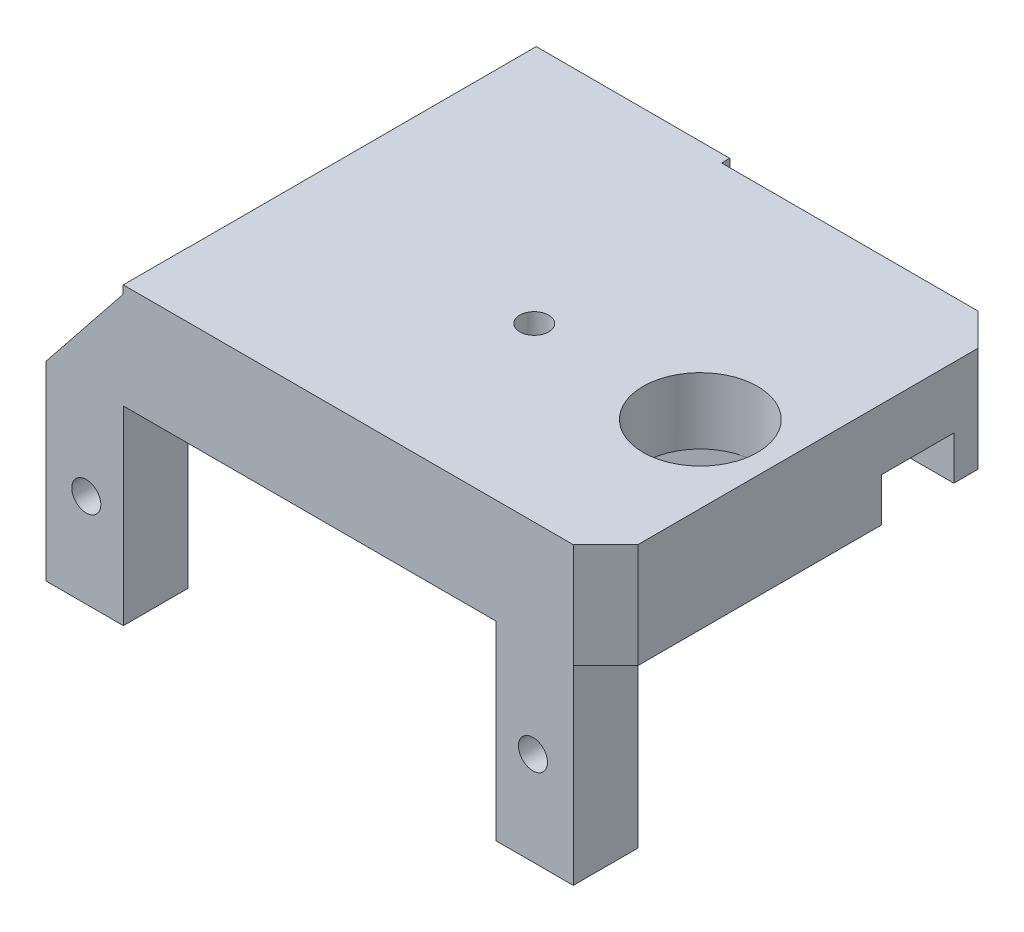
ISO-10303-21;
HEADER;
FILE_DESCRIPTION(('STEP AP214'),'2;1');
FILE_NAME('part.step','',(''),(''),'','','');
FILE_SCHEMA(('AUTOMOTIVE_DESIGN { 1 0 10303 214 1 1 1 1 }'));
ENDSEC;
DATA;
#1=APPLICATION_CONTEXT('core data for automotive mechanical design processes');
#2=APPLICATION_PROTOCOL_DEFINITION('international standard','automotive_design',2000,#1);
#3=PRODUCT_CONTEXT('',#1,'mechanical');
#4=PRODUCT('Part','Part','',(#3));
#5=PRODUCT_RELATED_PRODUCT_CATEGORY('part','',(#4));
#6=PRODUCT_DEFINITION_FORMATION('','',#4);
#7=PRODUCT_DEFINITION_CONTEXT('part definition',#1,'design');
#8=PRODUCT_DEFINITION('design','',#6,#7);
#9=PRODUCT_DEFINITION_SHAPE('','',#8);
#10=(LENGTH_UNIT() NAMED_UNIT(*) SI_UNIT(.MILLI.,.METRE.));
#11=(NAMED_UNIT(*) PLANE_ANGLE_UNIT() SI_UNIT($,.RADIAN.));
#12=(NAMED_UNIT(*) SI_UNIT($,.STERADIAN.) SOLID_ANGLE_UNIT());
#13=UNCERTAINTY_MEASURE_WITH_UNIT(LENGTH_MEASURE(1.E-05),#10,'distance_accuracy_value','');
#14=(GEOMETRIC_REPRESENTATION_CONTEXT(3) GLOBAL_UNCERTAINTY_ASSIGNED_CONTEXT((#13)) GLOBAL_UNIT_ASSIGNED_CONTEXT((#10,
#11,#12)) REPRESENTATION_CONTEXT('',''));
#15=CARTESIAN_POINT('',(0.,0.,0.));
#16=DIRECTION('',(0.,0.,1.));
#17=DIRECTION('',(1.,0.,0.));
#18=AXIS2_PLACEMENT_3D('',#15,#16,#17);
#19=CARTESIAN_POINT('',(-48.2602629267397,6.,0.));
#20=DIRECTION('',(0.78152047241882,-0.623879596709385,0.));
#21=DIRECTION('',(0.,0.,-1.));
#22=AXIS2_PLACEMENT_3D('',#19,#20,#21);
#23=PLANE('',#22);
#24=DIRECTION('',(0.,0.,-1.));
#25=VECTOR('',#24,1.);
#26=CARTESIAN_POINT('',(-48.2602629267397,6.,0.));
#27=LINE('',#26,#25);
#28=CARTESIAN_POINT('',(-48.2602629267397,6.,13.55));
#29=VERTEX_POINT('',#28);
#30=CARTESIAN_POINT('',(-48.2602629267397,6.,9.55));
#31=VERTEX_POINT('',#30);
#32=EDGE_CURVE('E425',#29,#31,#27,.T.);
#33=ORIENTED_EDGE('',*,*,#32,.T.);
#34=DIRECTION('',(0.623879596709387,0.781520472418818,0.));
#35=VECTOR('',#34,1.);
#36=CARTESIAN_POINT('',(-53.05,0.,9.55));
#37=LINE('',#36,#35);
#38=CARTESIAN_POINT('',(-53.05,0.,9.55));
#39=VERTEX_POINT('',#38);
#40=EDGE_CURVE('E266',#39,#31,#37,.T.);
#41=ORIENTED_EDGE('',*,*,#40,.F.);
#42=DIRECTION('',(0.,0.,1.));
#43=VECTOR('',#42,1.);
#44=CARTESIAN_POINT('',(-53.05,0.,11.55));
#45=LINE('',#44,#43);
#46=CARTESIAN_POINT('',(-53.05,0.,13.55));
#47=VERTEX_POINT('',#46);
#48=EDGE_CURVE('E428',#39,#47,#45,.T.);
#49=ORIENTED_EDGE('',*,*,#48,.T.);
#50=DIRECTION('',(-0.623879596709385,-0.78152047241882,0.));
#51=VECTOR('',#50,1.);
#52=CARTESIAN_POINT('',(-48.2602629267397,6.,13.55));
#53=LINE('',#52,#51);
#54=EDGE_CURVE('E303',#29,#47,#53,.T.);
#55=ORIENTED_EDGE('',*,*,#54,.F.);
#56=EDGE_LOOP('',(#33,#41,#49,#55));
#57=FACE_BOUND('',#56,.T.);
#58=ADVANCED_FACE('F32',(#57),#23,.F.);
#59=CARTESIAN_POINT('',(-20.35,-11.8,11.55));
#60=DIRECTION('',(1.,0.,0.));
#61=DIRECTION('',(0.,0.,1.));
#62=AXIS2_PLACEMENT_3D('',#59,#60,#61);
#63=PLANE('',#62);
#64=DIRECTION('',(0.,0.,1.));
#65=VECTOR('',#64,1.);
#66=CARTESIAN_POINT('',(-20.35,0.,0.));
#67=LINE('',#66,#65);
#68=CARTESIAN_POINT('',(-20.35,0.,9.55));
#69=VERTEX_POINT('',#68);
#70=CARTESIAN_POINT('',(-20.35,0.,13.55));
#71=VERTEX_POINT('',#70);
#72=EDGE_CURVE('E420',#69,#71,#67,.T.);
#73=ORIENTED_EDGE('',*,*,#72,.T.);
#74=DIRECTION('',(0.,1.,0.));
#75=VECTOR('',#74,1.);
#76=CARTESIAN_POINT('',(-20.35,0.,13.55));
#77=LINE('',#76,#75);
#78=CARTESIAN_POINT('',(-20.35,-11.8,13.55));
#79=VERTEX_POINT('',#78);
#80=EDGE_CURVE('E300',#79,#71,#77,.T.);
#81=ORIENTED_EDGE('',*,*,#80,.F.);
#82=DIRECTION('',(0.,0.,1.));
#83=VECTOR('',#82,1.);
#84=CARTESIAN_POINT('',(-20.35,-11.8,11.55));
#85=LINE('',#84,#83);
#86=CARTESIAN_POINT('',(-20.35,-11.8,9.55));
#87=VERTEX_POINT('',#86);
#88=EDGE_CURVE('E376',#87,#79,#85,.T.);
#89=ORIENTED_EDGE('',*,*,#88,.F.);
#90=DIRECTION('',(0.,-1.,0.));
#91=VECTOR('',#90,1.);
#92=CARTESIAN_POINT('',(-20.35,0.,9.55));
#93=LINE('',#92,#91);
#94=EDGE_CURVE('E48',#69,#87,#93,.T.);
#95=ORIENTED_EDGE('',*,*,#94,.F.);
#96=EDGE_LOOP('',(#73,#81,#89,#95));
#97=FACE_BOUND('',#96,.T.);
#98=ADVANCED_FACE('F526',(#97),#63,.T.);
#99=CARTESIAN_POINT('',(-25.15,-11.8,11.55));
#100=DIRECTION('',(-1.,0.,0.));
#101=DIRECTION('',(0.,0.,-1.));
#102=AXIS2_PLACEMENT_3D('',#99,#100,#101);
#103=PLANE('',#102);
#104=DIRECTION('',(0.,0.,-1.));
#105=VECTOR('',#104,1.);
#106=CARTESIAN_POINT('',(-25.15,0.,0.));
#107=LINE('',#106,#105);
#108=CARTESIAN_POINT('',(-25.15,0.,13.55));
#109=VERTEX_POINT('',#108);
#110=CARTESIAN_POINT('',(-25.15,0.,9.55));
#111=VERTEX_POINT('',#110);
#112=EDGE_CURVE('E422',#109,#111,#107,.T.);
#113=ORIENTED_EDGE('',*,*,#112,.T.);
#114=DIRECTION('',(0.,-1.,0.));
#115=VECTOR('',#114,1.);
#116=CARTESIAN_POINT('',(-25.15,-11.8,9.55));
#117=LINE('',#116,#115);
#118=CARTESIAN_POINT('',(-25.15,-11.8,9.55));
#119=VERTEX_POINT('',#118);
#120=EDGE_CURVE('E291',#111,#119,#117,.T.);
#121=ORIENTED_EDGE('',*,*,#120,.T.);
#122=DIRECTION('',(0.,0.,-1.));
#123=VECTOR('',#122,1.);
#124=CARTESIAN_POINT('',(-25.15,-11.8,11.55));
#125=LINE('',#124,#123);
#126=CARTESIAN_POINT('',(-25.15,-11.8,13.55));
#127=VERTEX_POINT('',#126);
#128=EDGE_CURVE('E373',#127,#119,#125,.T.);
#129=ORIENTED_EDGE('',*,*,#128,.F.);
#130=DIRECTION('',(0.,-1.,0.));
#131=VECTOR('',#130,1.);
#132=CARTESIAN_POINT('',(-25.15,0.,13.55));
#133=LINE('',#132,#131);
#134=EDGE_CURVE('E318',#109,#127,#133,.T.);
#135=ORIENTED_EDGE('',*,*,#134,.F.);
#136=EDGE_LOOP('',(#113,#121,#129,#135));
#137=FACE_BOUND('',#136,.T.);
#138=ADVANCED_FACE('F519',(#137),#103,.T.);
#139=CARTESIAN_POINT('',(-36.7,-11.8,0.));
#140=DIRECTION('',(0.,1.,0.));
#141=DIRECTION('',(0.,0.,1.));
#142=AXIS2_PLACEMENT_3D('',#139,#140,#141);
#143=PLANE('',#142);
#144=DIRECTION('',(-1.,0.,0.));
#145=VECTOR('',#144,1.);
#146=CARTESIAN_POINT('',(-20.35,-11.8,9.55));
#147=LINE('',#146,#145);
#148=EDGE_CURVE('E278',#87,#119,#147,.T.);
#149=ORIENTED_EDGE('',*,*,#148,.F.);
#150=ORIENTED_EDGE('',*,*,#88,.T.);
#151=DIRECTION('',(1.,0.,0.));
#152=VECTOR('',#151,1.);
#153=CARTESIAN_POINT('',(-25.15,-11.8,13.55));
#154=LINE('',#153,#152);
#155=EDGE_CURVE('E321',#127,#79,#154,.T.);
#156=ORIENTED_EDGE('',*,*,#155,.F.);
#157=ORIENTED_EDGE('',*,*,#128,.T.);
#158=EDGE_LOOP('',(#149,#150,#156,#157));
#159=FACE_BOUND('',#158,.T.);
#160=ADVANCED_FACE('F522',(#159),#143,.F.);
#161=CARTESIAN_POINT('',(-48.25,-11.8,11.55));
#162=DIRECTION('',(1.,0.,0.));
#163=DIRECTION('',(0.,0.,1.));
#164=AXIS2_PLACEMENT_3D('',#161,#162,#163);
#165=PLANE('',#164);
#166=DIRECTION('',(0.,0.,1.));
#167=VECTOR('',#166,1.);
#168=CARTESIAN_POINT('',(-48.25,-11.8,11.55));
#169=LINE('',#168,#167);
#170=CARTESIAN_POINT('',(-48.25,-11.8,9.55));
#171=VERTEX_POINT('',#170);
#172=CARTESIAN_POINT('',(-48.25,-11.8,13.55));
#173=VERTEX_POINT('',#172);
#174=EDGE_CURVE('E360',#171,#173,#169,.T.);
#175=ORIENTED_EDGE('',*,*,#174,.F.);
#176=DIRECTION('',(0.,1.,0.));
#177=VECTOR('',#176,1.);
#178=CARTESIAN_POINT('',(-48.25,-11.8,9.55));
#179=LINE('',#178,#177);
#180=CARTESIAN_POINT('',(-48.25,0.,9.55));
#181=VERTEX_POINT('',#180);
#182=EDGE_CURVE('E288',#171,#181,#179,.T.);
#183=ORIENTED_EDGE('',*,*,#182,.T.);
#184=DIRECTION('',(0.,0.,-1.));
#185=VECTOR('',#184,1.);
#186=CARTESIAN_POINT('',(-48.25,0.,11.55));
#187=LINE('',#186,#185);
#188=CARTESIAN_POINT('',(-48.25,0.,13.55));
#189=VERTEX_POINT('',#188);
#190=EDGE_CURVE('E410',#189,#181,#187,.T.);
#191=ORIENTED_EDGE('',*,*,#190,.F.);
#192=DIRECTION('',(0.,1.,0.));
#193=VECTOR('',#192,1.);
#194=CARTESIAN_POINT('',(-48.25,-11.8,13.55));
#195=LINE('',#194,#193);
#196=EDGE_CURVE('E312',#173,#189,#195,.T.);
#197=ORIENTED_EDGE('',*,*,#196,.F.);
#198=EDGE_LOOP('',(#175,#183,#191,#197));
#199=FACE_BOUND('',#198,.T.);
#200=ADVANCED_FACE('F509',(#199),#165,.T.);
#201=CARTESIAN_POINT('',(-53.05,-11.8,11.55));
#202=DIRECTION('',(-1.,0.,0.));
#203=DIRECTION('',(0.,0.,-1.));
#204=AXIS2_PLACEMENT_3D('',#201,#202,#203);
#205=PLANE('',#204);
#206=ORIENTED_EDGE('',*,*,#48,.F.);
#207=DIRECTION('',(0.,1.,0.));
#208=VECTOR('',#207,1.);
#209=CARTESIAN_POINT('',(-53.05,0.,9.55));
#210=LINE('',#209,#208);
#211=CARTESIAN_POINT('',(-53.05,-11.8,9.55));
#212=VERTEX_POINT('',#211);
#213=EDGE_CURVE('E280',#212,#39,#210,.T.);
#214=ORIENTED_EDGE('',*,*,#213,.F.);
#215=DIRECTION('',(0.,0.,-1.));
#216=VECTOR('',#215,1.);
#217=CARTESIAN_POINT('',(-53.05,-11.8,11.55));
#218=LINE('',#217,#216);
#219=CARTESIAN_POINT('',(-53.05,-11.8,13.55));
#220=VERTEX_POINT('',#219);
#221=EDGE_CURVE('E370',#220,#212,#218,.T.);
#222=ORIENTED_EDGE('',*,*,#221,.F.);
#223=DIRECTION('',(0.,-1.,0.));
#224=VECTOR('',#223,1.);
#225=CARTESIAN_POINT('',(-53.05,0.,13.55));
#226=LINE('',#225,#224);
#227=EDGE_CURVE('E306',#47,#220,#226,.T.);
#228=ORIENTED_EDGE('',*,*,#227,.F.);
#229=EDGE_LOOP('',(#206,#214,#222,#228));
#230=FACE_BOUND('',#229,.T.);
#231=ADVANCED_FACE('F501',(#230),#205,.T.);
#232=CARTESIAN_POINT('',(-36.7,-11.8,0.));
#233=DIRECTION('',(0.,-1.,0.));
#234=DIRECTION('',(0.,0.,-1.));
#235=AXIS2_PLACEMENT_3D('',#232,#233,#234);
#236=PLANE('',#235);
#237=ORIENTED_EDGE('',*,*,#221,.T.);
#238=EDGE_CURVE('E277',#171,#212,#147,.T.);
#239=ORIENTED_EDGE('',*,*,#238,.F.);
#240=ORIENTED_EDGE('',*,*,#174,.T.);
#241=DIRECTION('',(1.,0.,0.));
#242=VECTOR('',#241,1.);
#243=CARTESIAN_POINT('',(-53.05,-11.8,13.55));
#244=LINE('',#243,#242);
#245=EDGE_CURVE('E309',#220,#173,#244,.T.);
#246=ORIENTED_EDGE('',*,*,#245,.F.);
#247=EDGE_LOOP('',(#237,#239,#240,#246));
#248=FACE_BOUND('',#247,.T.);
#249=ADVANCED_FACE('F505',(#248),#236,.T.);
#250=CARTESIAN_POINT('',(-50.55,-6.,-6.25));
#251=DIRECTION('',(0.,0.,1.));
#252=DIRECTION('',(-1.,0.,0.));
#253=AXIS2_PLACEMENT_3D('',#250,#251,#252);
#254=CYLINDRICAL_SURFACE('',#253,0.9);
#255=CARTESIAN_POINT('',(-50.55,-6.,13.55));
#256=DIRECTION('',(0.,0.,1.));
#257=DIRECTION('',(1.,0.,0.));
#258=AXIS2_PLACEMENT_3D('',#255,#256,#257);
#259=CIRCLE('',#258,0.899999999999997);
#260=CARTESIAN_POINT('',(-49.65,-6.,13.55));
#261=VERTEX_POINT('',#260);
#262=EDGE_CURVE('E294',#261,#261,#259,.T.);
#263=ORIENTED_EDGE('',*,*,#262,.T.);
#264=EDGE_LOOP('',(#263));
#265=FACE_BOUND('',#264,.T.);
#266=CARTESIAN_POINT('',(-50.55,-6.,9.55));
#267=DIRECTION('',(0.,0.,-1.));
#268=DIRECTION('',(-1.,0.,0.));
#269=AXIS2_PLACEMENT_3D('',#266,#267,#268);
#270=CIRCLE('',#269,0.9);
#271=CARTESIAN_POINT('',(-51.45,-6.,9.55));
#272=VERTEX_POINT('',#271);
#273=EDGE_CURVE('E285',#272,#272,#270,.F.);
#274=ORIENTED_EDGE('',*,*,#273,.F.);
#275=EDGE_LOOP('',(#274));
#276=FACE_BOUND('',#275,.T.);
#277=ADVANCED_FACE('F603',(#265,#276),#254,.F.);
#278=CARTESIAN_POINT('',(-22.85,-6.,-6.25));
#279=DIRECTION('',(0.,0.,1.));
#280=DIRECTION('',(-1.,0.,0.));
#281=AXIS2_PLACEMENT_3D('',#278,#279,#280);
#282=CYLINDRICAL_SURFACE('',#281,0.9);
#283=CARTESIAN_POINT('',(-22.85,-6.,13.55));
#284=DIRECTION('',(0.,0.,1.));
#285=DIRECTION('',(1.,0.,0.));
#286=AXIS2_PLACEMENT_3D('',#283,#284,#285);
#287=CIRCLE('',#286,0.9);
#288=CARTESIAN_POINT('',(-21.95,-6.,13.55));
#289=VERTEX_POINT('',#288);
#290=EDGE_CURVE('E297',#289,#289,#287,.T.);
#291=ORIENTED_EDGE('',*,*,#290,.T.);
#292=EDGE_LOOP('',(#291));
#293=FACE_BOUND('',#292,.T.);
#294=CARTESIAN_POINT('',(-22.85,-6.,9.55));
#295=DIRECTION('',(0.,0.,-1.));
#296=DIRECTION('',(-1.,0.,0.));
#297=AXIS2_PLACEMENT_3D('',#294,#295,#296);
#298=CIRCLE('',#297,0.9);
#299=CARTESIAN_POINT('',(-23.75,-6.,9.55));
#300=VERTEX_POINT('',#299);
#301=EDGE_CURVE('E36',#300,#300,#298,.F.);
#302=ORIENTED_EDGE('',*,*,#301,.F.);
#303=EDGE_LOOP('',(#302));
#304=FACE_BOUND('',#303,.T.);
#305=ADVANCED_FACE('F638',(#293,#304),#282,.F.);
#306=CARTESIAN_POINT('',(-36.7,0.,0.));
#307=DIRECTION('',(0.,1.,0.));
#308=DIRECTION('',(0.,0.,1.));
#309=AXIS2_PLACEMENT_3D('',#306,#307,#308);
#310=PLANE('',#309);
#311=ORIENTED_EDGE('',*,*,#190,.T.);
#312=CARTESIAN_POINT('',(-48.25,0.,-3.55));
#313=VERTEX_POINT('',#312);
#314=EDGE_CURVE('E414',#181,#313,#187,.T.);
#315=ORIENTED_EDGE('',*,*,#314,.T.);
#316=DIRECTION('',(-1.,0.,0.));
#317=VECTOR('',#316,1.);
#318=CARTESIAN_POINT('',(-18.35,0.,-3.55));
#319=LINE('',#318,#317);
#320=CARTESIAN_POINT('',(-18.35,0.,-3.55));
#321=VERTEX_POINT('',#320);
#322=EDGE_CURVE('E333',#321,#313,#319,.T.);
#323=ORIENTED_EDGE('',*,*,#322,.F.);
#324=DIRECTION('',(0.,0.,1.));
#325=VECTOR('',#324,1.);
#326=CARTESIAN_POINT('',(-18.35,0.,-11.55));
#327=LINE('',#326,#325);
#328=CARTESIAN_POINT('',(-18.35,0.,11.55));
#329=VERTEX_POINT('',#328);
#330=EDGE_CURVE('E400',#321,#329,#327,.T.);
#331=ORIENTED_EDGE('',*,*,#330,.T.);
#332=DIRECTION('',(0.707106781186545,0.,-0.70710678118655));
#333=VECTOR('',#332,1.);
#334=CARTESIAN_POINT('',(-18.35,0.,11.55));
#335=LINE('',#334,#333);
#336=EDGE_CURVE('E270',#71,#329,#335,.T.);
#337=ORIENTED_EDGE('',*,*,#336,.F.);
#338=ORIENTED_EDGE('',*,*,#72,.F.);
#339=DIRECTION('',(1.,0.,0.));
#340=VECTOR('',#339,1.);
#341=CARTESIAN_POINT('',(-20.35,0.,9.55));
#342=LINE('',#341,#340);
#343=EDGE_CURVE('E283',#111,#69,#342,.T.);
#344=ORIENTED_EDGE('',*,*,#343,.F.);
#345=ORIENTED_EDGE('',*,*,#112,.F.);
#346=DIRECTION('',(1.,0.,0.));
#347=VECTOR('',#346,1.);
#348=CARTESIAN_POINT('',(-48.25,0.,13.55));
#349=LINE('',#348,#347);
#350=EDGE_CURVE('E315',#189,#109,#349,.T.);
#351=ORIENTED_EDGE('',*,*,#350,.F.);
#352=EDGE_LOOP('',(#311,#315,#323,#331,#337,#338,#344,#345,#351));
#353=FACE_BOUND('',#352,.T.);
#354=DIRECTION('',(0.995550934756682,0.,0.0942249240121579));
#355=VECTOR('',#354,1.);
#356=CARTESIAN_POINT('',(-39.7793913280243,0.,4.87110186951336));
#357=LINE('',#356,#355);
#358=CARTESIAN_POINT('',(-39.7793913280243,0.,4.87110186951336));
#359=VERTEX_POINT('',#358);
#360=CARTESIAN_POINT('',(-23.4754399602432,0.,6.41420581838622));
#361=VERTEX_POINT('',#360);
#362=EDGE_CURVE('E390',#359,#361,#357,.T.);
#363=ORIENTED_EDGE('',*,*,#362,.T.);
#364=CARTESIAN_POINT('',(-23.14094148,0.,2.88));
#365=DIRECTION('',(0.,1.,0.));
#366=DIRECTION('',(0.,0.,-1.));
#367=AXIS2_PLACEMENT_3D('',#364,#365,#366);
#368=CIRCLE('',#367,3.55);
#369=CARTESIAN_POINT('',(-23.4754399602432,0.,-0.654205818386221));
#370=VERTEX_POINT('',#369);
#371=EDGE_CURVE('E393',#361,#370,#368,.T.);
#372=ORIENTED_EDGE('',*,*,#371,.T.);
#373=DIRECTION('',(-0.995550934756682,0.,0.0942249240121579));
#374=VECTOR('',#373,1.);
#375=CARTESIAN_POINT('',(-39.7793913280243,0.,0.888898130486633));
#376=LINE('',#375,#374);
#377=CARTESIAN_POINT('',(-39.7793913280243,0.,0.888898130486633));
#378=VERTEX_POINT('',#377);
#379=EDGE_CURVE('E383',#370,#378,#376,.T.);
#380=ORIENTED_EDGE('',*,*,#379,.T.);
#381=CARTESIAN_POINT('',(-39.59094148,0.,2.88));
#382=DIRECTION('',(0.,1.,0.));
#383=DIRECTION('',(0.,0.,1.));
#384=AXIS2_PLACEMENT_3D('',#381,#382,#383);
#385=CIRCLE('',#384,2.);
#386=EDGE_CURVE('E378',#378,#359,#385,.T.);
#387=ORIENTED_EDGE('',*,*,#386,.T.);
#388=EDGE_LOOP('',(#363,#372,#380,#387));
#389=FACE_BOUND('',#388,.T.);
#390=ADVANCED_FACE('F513',(#353,#389),#310,.F.);
#391=CARTESIAN_POINT('',(-48.25,6.,-11.55));
#392=DIRECTION('',(0.,0.,1.));
#393=DIRECTION('',(-1.,0.,0.));
#394=AXIS2_PLACEMENT_3D('',#391,#392,#393);
#395=PLANE('',#394);
#396=DIRECTION('',(1.,0.,0.));
#397=VECTOR('',#396,1.);
#398=CARTESIAN_POINT('',(-48.25,0.,-11.55));
#399=LINE('',#398,#397);
#400=CARTESIAN_POINT('',(-36.25,0.,-11.55));
#401=VERTEX_POINT('',#400);
#402=CARTESIAN_POINT('',(-20.35,0.,-11.55));
#403=VERTEX_POINT('',#402);
#404=EDGE_CURVE('E413',#401,#403,#399,.T.);
#405=ORIENTED_EDGE('',*,*,#404,.F.);
#406=DIRECTION('',(0.,1.,0.));
#407=VECTOR('',#406,1.);
#408=CARTESIAN_POINT('',(-36.25,-11.8,-11.55));
#409=LINE('',#408,#407);
#410=CARTESIAN_POINT('',(-36.25,6.5,-11.55));
#411=VERTEX_POINT('',#410);
#412=EDGE_CURVE('E368',#401,#411,#409,.T.);
#413=ORIENTED_EDGE('',*,*,#412,.T.);
#414=DIRECTION('',(-1.,0.,0.));
#415=VECTOR('',#414,1.);
#416=CARTESIAN_POINT('',(-20.35,6.5,-11.55));
#417=LINE('',#416,#415);
#418=CARTESIAN_POINT('',(-20.35,6.5,-11.55));
#419=VERTEX_POINT('',#418);
#420=EDGE_CURVE('E474',#419,#411,#417,.T.);
#421=ORIENTED_EDGE('',*,*,#420,.F.);
#422=DIRECTION('',(0.,1.,0.));
#423=VECTOR('',#422,1.);
#424=CARTESIAN_POINT('',(-20.35,6.,-11.55));
#425=LINE('',#424,#423);
#426=EDGE_CURVE('E11',#403,#419,#425,.T.);
#427=ORIENTED_EDGE('',*,*,#426,.F.);
#428=EDGE_LOOP('',(#405,#413,#421,#427));
#429=FACE_BOUND('',#428,.T.);
#430=ADVANCED_FACE('F473',(#429),#395,.F.);
#431=CARTESIAN_POINT('',(-48.25,6.,11.55));
#432=DIRECTION('',(1.,0.,0.));
#433=DIRECTION('',(0.,0.,1.));
#434=AXIS2_PLACEMENT_3D('',#431,#432,#433);
#435=PLANE('',#434);
#436=DIRECTION('',(0.,0.,-1.));
#437=VECTOR('',#436,1.);
#438=CARTESIAN_POINT('',(-48.25,2.7,-3.55));
#439=LINE('',#438,#437);
#440=CARTESIAN_POINT('',(-48.25,2.7,-3.55));
#441=VERTEX_POINT('',#440);
#442=CARTESIAN_POINT('',(-48.25,2.7,-8.05));
#443=VERTEX_POINT('',#442);
#444=EDGE_CURVE('E251',#441,#443,#439,.T.);
#445=ORIENTED_EDGE('',*,*,#444,.F.);
#446=DIRECTION('',(0.,-1.,0.));
#447=VECTOR('',#446,1.);
#448=CARTESIAN_POINT('',(-48.25,0.,-3.55));
#449=LINE('',#448,#447);
#450=EDGE_CURVE('E327',#441,#313,#449,.T.);
#451=ORIENTED_EDGE('',*,*,#450,.T.);
#452=ORIENTED_EDGE('',*,*,#314,.F.);
#453=DIRECTION('',(0.,-1.,0.));
#454=VECTOR('',#453,1.);
#455=CARTESIAN_POINT('',(-48.25,6.,9.55));
#456=LINE('',#455,#454);
#457=CARTESIAN_POINT('',(-48.25,6.5,9.55));
#458=VERTEX_POINT('',#457);
#459=EDGE_CURVE('E227',#458,#181,#456,.T.);
#460=ORIENTED_EDGE('',*,*,#459,.F.);
#461=DIRECTION('',(0.,0.,1.));
#462=VECTOR('',#461,1.);
#463=CARTESIAN_POINT('',(-48.25,6.5,-12.0542762194749));
#464=LINE('',#463,#462);
#465=CARTESIAN_POINT('',(-48.25,6.5,-12.0542762194749));
#466=VERTEX_POINT('',#465);
#467=EDGE_CURVE('E218',#466,#458,#464,.T.);
#468=ORIENTED_EDGE('',*,*,#467,.F.);
#469=DIRECTION('',(0.,-1.,0.));
#470=VECTOR('',#469,1.);
#471=CARTESIAN_POINT('',(-48.25,6.5,-12.0542762194749));
#472=LINE('',#471,#470);
#473=CARTESIAN_POINT('',(-48.25,6.,-12.0542762194749));
#474=VERTEX_POINT('',#473);
#475=EDGE_CURVE('E224',#466,#474,#472,.T.);
#476=ORIENTED_EDGE('',*,*,#475,.T.);
#477=DIRECTION('',(0.,-0.78152047241882,-0.623879596709385));
#478=VECTOR('',#477,1.);
#479=CARTESIAN_POINT('',(-48.25,6.,-12.0542762194749));
#480=LINE('',#479,#478);
#481=CARTESIAN_POINT('',(-48.25,3.5,-14.05));
#482=VERTEX_POINT('',#481);
#483=EDGE_CURVE('E436',#482,#474,#480,.F.);
#484=ORIENTED_EDGE('',*,*,#483,.F.);
#485=DIRECTION('',(0.,1.,0.));
#486=VECTOR('',#485,1.);
#487=CARTESIAN_POINT('',(-48.25,-11.8,-14.05));
#488=LINE('',#487,#486);
#489=CARTESIAN_POINT('',(-48.25,-11.8,-14.05));
#490=VERTEX_POINT('',#489);
#491=EDGE_CURVE('E361',#490,#482,#488,.T.);
#492=ORIENTED_EDGE('',*,*,#491,.F.);
#493=DIRECTION('',(0.,0.,-1.));
#494=VECTOR('',#493,1.);
#495=CARTESIAN_POINT('',(-48.25,-11.8,-11.55));
#496=LINE('',#495,#494);
#497=CARTESIAN_POINT('',(-48.25,-11.8,-11.55));
#498=VERTEX_POINT('',#497);
#499=EDGE_CURVE('E351',#498,#490,#496,.T.);
#500=ORIENTED_EDGE('',*,*,#499,.F.);
#501=DIRECTION('',(0.,1.,0.));
#502=VECTOR('',#501,1.);
#503=CARTESIAN_POINT('',(-48.25,-11.8,-11.55));
#504=LINE('',#503,#502);
#505=CARTESIAN_POINT('',(-48.25,0.,-11.55));
#506=VERTEX_POINT('',#505);
#507=EDGE_CURVE('E364',#498,#506,#504,.T.);
#508=ORIENTED_EDGE('',*,*,#507,.T.);
#509=CARTESIAN_POINT('',(-48.25,0.,-8.05));
#510=VERTEX_POINT('',#509);
#511=EDGE_CURVE('E409',#510,#506,#187,.T.);
#512=ORIENTED_EDGE('',*,*,#511,.F.);
#513=DIRECTION('',(0.,1.,0.));
#514=VECTOR('',#513,1.);
#515=CARTESIAN_POINT('',(-48.25,0.,-8.05));
#516=LINE('',#515,#514);
#517=EDGE_CURVE('E331',#510,#443,#516,.T.);
#518=ORIENTED_EDGE('',*,*,#517,.T.);
#519=EDGE_LOOP('',(#445,#451,#452,#460,#468,#476,#484,#492,#500,#508,#512,#518));
#520=FACE_BOUND('',#519,.T.);
#521=ADVANCED_FACE('F221',(#520),#435,.F.);
#522=CARTESIAN_POINT('',(-18.35,0.,-9.54999999999999));
#523=VERTEX_POINT('',#522);
#524=CARTESIAN_POINT('',(-18.35,0.,-8.05));
#525=VERTEX_POINT('',#524);
#526=EDGE_CURVE('E406',#523,#525,#327,.T.);
#527=ORIENTED_EDGE('',*,*,#526,.T.);
#528=DIRECTION('',(-1.,0.,0.));
#529=VECTOR('',#528,1.);
#530=CARTESIAN_POINT('',(-18.35,0.,-8.05));
#531=LINE('',#530,#529);
#532=EDGE_CURVE('E336',#525,#510,#531,.T.);
#533=ORIENTED_EDGE('',*,*,#532,.T.);
#534=ORIENTED_EDGE('',*,*,#511,.T.);
#535=EDGE_CURVE('E415',#506,#401,#399,.T.);
#536=ORIENTED_EDGE('',*,*,#535,.T.);
#537=ORIENTED_EDGE('',*,*,#404,.T.);
#538=DIRECTION('',(0.707106781186548,0.,0.707106781186548));
#539=VECTOR('',#538,1.);
#540=CARTESIAN_POINT('',(-18.35,0.,-9.54999999999999));
#541=LINE('',#540,#539);
#542=EDGE_CURVE('E41',#523,#403,#541,.F.);
#543=ORIENTED_EDGE('',*,*,#542,.F.);
#544=EDGE_LOOP('',(#527,#533,#534,#536,#537,#543));
#545=FACE_BOUND('',#544,.T.);
#546=ADVANCED_FACE('F449',(#545),#310,.F.);
#547=CARTESIAN_POINT('',(-18.35,6.,-11.55));
#548=DIRECTION('',(-1.,0.,0.));
#549=DIRECTION('',(0.,0.,-1.));
#550=AXIS2_PLACEMENT_3D('',#547,#548,#549);
#551=PLANE('',#550);
#552=DIRECTION('',(0.,-1.,0.));
#553=VECTOR('',#552,1.);
#554=CARTESIAN_POINT('',(-18.35,0.,-3.55));
#555=LINE('',#554,#553);
#556=CARTESIAN_POINT('',(-18.35,2.7,-3.55));
#557=VERTEX_POINT('',#556);
#558=EDGE_CURVE('E328',#557,#321,#555,.T.);
#559=ORIENTED_EDGE('',*,*,#558,.F.);
#560=DIRECTION('',(0.,0.,1.));
#561=VECTOR('',#560,1.);
#562=CARTESIAN_POINT('',(-18.35,2.7,-8.05));
#563=LINE('',#562,#561);
#564=CARTESIAN_POINT('',(-18.35,2.7,-8.05));
#565=VERTEX_POINT('',#564);
#566=EDGE_CURVE('E262',#565,#557,#563,.T.);
#567=ORIENTED_EDGE('',*,*,#566,.F.);
#568=DIRECTION('',(0.,1.,0.));
#569=VECTOR('',#568,1.);
#570=CARTESIAN_POINT('',(-18.35,0.,-8.05));
#571=LINE('',#570,#569);
#572=EDGE_CURVE('E330',#525,#565,#571,.T.);
#573=ORIENTED_EDGE('',*,*,#572,.F.);
#574=ORIENTED_EDGE('',*,*,#526,.F.);
#575=DIRECTION('',(0.,-1.,0.));
#576=VECTOR('',#575,1.);
#577=CARTESIAN_POINT('',(-18.35,6.,-9.54999999999999));
#578=LINE('',#577,#576);
#579=CARTESIAN_POINT('',(-18.35,6.5,-9.54999999999999));
#580=VERTEX_POINT('',#579);
#581=EDGE_CURVE('E438',#580,#523,#578,.T.);
#582=ORIENTED_EDGE('',*,*,#581,.F.);
#583=DIRECTION('',(0.,0.,-1.));
#584=VECTOR('',#583,1.);
#585=CARTESIAN_POINT('',(-18.35,6.5,11.55));
#586=LINE('',#585,#584);
#587=CARTESIAN_POINT('',(-18.35,6.5,11.55));
#588=VERTEX_POINT('',#587);
#589=EDGE_CURVE('E476',#588,#580,#586,.T.);
#590=ORIENTED_EDGE('',*,*,#589,.F.);
#591=DIRECTION('',(0.,1.,0.));
#592=VECTOR('',#591,1.);
#593=CARTESIAN_POINT('',(-18.35,-4.4721359549996,11.55));
#594=LINE('',#593,#592);
#595=EDGE_CURVE('E273',#329,#588,#594,.T.);
#596=ORIENTED_EDGE('',*,*,#595,.F.);
#597=ORIENTED_EDGE('',*,*,#330,.F.);
#598=EDGE_LOOP('',(#559,#567,#573,#574,#582,#590,#596,#597));
#599=FACE_BOUND('',#598,.T.);
#600=ADVANCED_FACE('F451',(#599),#551,.F.);
#601=CARTESIAN_POINT('',(-39.59094148,2.4,2.88));
#602=DIRECTION('',(0.,-1.,0.));
#603=DIRECTION('',(0.,0.,-1.));
#604=AXIS2_PLACEMENT_3D('',#601,#602,#603);
#605=CYLINDRICAL_SURFACE('',#604,2.);
#606=ORIENTED_EDGE('',*,*,#386,.F.);
#607=DIRECTION('',(0.,-1.,0.));
#608=VECTOR('',#607,1.);
#609=CARTESIAN_POINT('',(-39.7793913280243,2.4,0.888898130486633));
#610=LINE('',#609,#608);
#611=CARTESIAN_POINT('',(-39.7793913280243,2.4,0.888898130486633));
#612=VERTEX_POINT('',#611);
#613=EDGE_CURVE('E398',#612,#378,#610,.T.);
#614=ORIENTED_EDGE('',*,*,#613,.F.);
#615=CARTESIAN_POINT('',(-39.59094148,2.4,2.88));
#616=DIRECTION('',(0.,1.,0.));
#617=DIRECTION('',(0.,0.,1.));
#618=AXIS2_PLACEMENT_3D('',#615,#616,#617);
#619=CIRCLE('',#618,2.);
#620=CARTESIAN_POINT('',(-39.7793913280243,2.4,4.87110186951336));
#621=VERTEX_POINT('',#620);
#622=EDGE_CURVE('E379',#612,#621,#619,.T.);
#623=ORIENTED_EDGE('',*,*,#622,.T.);
#624=DIRECTION('',(0.,-1.,0.));
#625=VECTOR('',#624,1.);
#626=CARTESIAN_POINT('',(-39.7793913280243,2.4,4.87110186951336));
#627=LINE('',#626,#625);
#628=EDGE_CURVE('E387',#621,#359,#627,.T.);
#629=ORIENTED_EDGE('',*,*,#628,.T.);
#630=EDGE_LOOP('',(#606,#614,#623,#629));
#631=FACE_BOUND('',#630,.T.);
#632=ADVANCED_FACE('F619',(#631),#605,.F.);
#633=CARTESIAN_POINT('',(-39.7793913280243,2.4,0.888898130486633));
#634=DIRECTION('',(-0.0942249240121579,0.,-0.995550934756682));
#635=DIRECTION('',(0.995550934756682,0.,-0.0942249240121579));
#636=AXIS2_PLACEMENT_3D('',#633,#634,#635);
#637=PLANE('',#636);
#638=ORIENTED_EDGE('',*,*,#379,.F.);
#639=DIRECTION('',(0.,-1.,0.));
#640=VECTOR('',#639,1.);
#641=CARTESIAN_POINT('',(-23.4754399602432,2.4,-0.654205818386221));
#642=LINE('',#641,#640);
#643=CARTESIAN_POINT('',(-23.4754399602432,2.4,-0.654205818386222));
#644=VERTEX_POINT('',#643);
#645=EDGE_CURVE('E401',#644,#370,#642,.T.);
#646=ORIENTED_EDGE('',*,*,#645,.F.);
#647=DIRECTION('',(-0.995550934756682,0.,0.0942249240121579));
#648=VECTOR('',#647,1.);
#649=CARTESIAN_POINT('',(-39.7793913280243,2.4,0.888898130486633));
#650=LINE('',#649,#648);
#651=EDGE_CURVE('E385',#644,#612,#650,.T.);
#652=ORIENTED_EDGE('',*,*,#651,.T.);
#653=ORIENTED_EDGE('',*,*,#613,.T.);
#654=EDGE_LOOP('',(#638,#646,#652,#653));
#655=FACE_BOUND('',#654,.T.);
#656=ADVANCED_FACE('F616',(#655),#637,.F.);
#657=CARTESIAN_POINT('',(-23.14094148,2.4,2.88));
#658=DIRECTION('',(0.,-1.,0.));
#659=DIRECTION('',(0.,0.,-1.));
#660=AXIS2_PLACEMENT_3D('',#657,#658,#659);
#661=CYLINDRICAL_SURFACE('',#660,3.55);
#662=ORIENTED_EDGE('',*,*,#371,.F.);
#663=DIRECTION('',(0.,-1.,0.));
#664=VECTOR('',#663,1.);
#665=CARTESIAN_POINT('',(-23.4754399602432,2.4,6.41420581838622));
#666=LINE('',#665,#664);
#667=CARTESIAN_POINT('',(-23.4754399602432,2.4,6.41420581838622));
#668=VERTEX_POINT('',#667);
#669=EDGE_CURVE('E403',#668,#361,#666,.T.);
#670=ORIENTED_EDGE('',*,*,#669,.F.);
#671=CARTESIAN_POINT('',(-23.14094148,2.4,2.88));
#672=DIRECTION('',(0.,-1.,0.));
#673=DIRECTION('',(0.,0.,1.));
#674=AXIS2_PLACEMENT_3D('',#671,#672,#673);
#675=CIRCLE('',#674,3.55);
#676=EDGE_CURVE('E418',#668,#644,#675,.T.);
#677=ORIENTED_EDGE('',*,*,#676,.T.);
#678=ORIENTED_EDGE('',*,*,#645,.T.);
#679=EDGE_LOOP('',(#662,#670,#677,#678));
#680=FACE_BOUND('',#679,.T.);
#681=CARTESIAN_POINT('',(-23.14094148,6.5,2.88));
#682=DIRECTION('',(0.,1.,0.));
#683=DIRECTION('',(0.,0.,1.));
#684=AXIS2_PLACEMENT_3D('',#681,#682,#683);
#685=CIRCLE('',#684,3.55);
#686=CARTESIAN_POINT('',(-23.14094148,6.5,6.43));
#687=VERTEX_POINT('',#686);
#688=EDGE_CURVE('E540',#687,#687,#685,.T.);
#689=ORIENTED_EDGE('',*,*,#688,.T.);
#690=EDGE_LOOP('',(#689));
#691=FACE_BOUND('',#690,.T.);
#692=ADVANCED_FACE('F544',(#680,#691),#661,.F.);
#693=CARTESIAN_POINT('',(-39.7793913280243,2.4,4.87110186951336));
#694=DIRECTION('',(-0.0942249240121579,0.,0.995550934756682));
#695=DIRECTION('',(-0.995550934756682,0.,-0.0942249240121579));
#696=AXIS2_PLACEMENT_3D('',#693,#694,#695);
#697=PLANE('',#696);
#698=ORIENTED_EDGE('',*,*,#362,.F.);
#699=ORIENTED_EDGE('',*,*,#628,.F.);
#700=DIRECTION('',(0.995550934756682,0.,0.0942249240121579));
#701=VECTOR('',#700,1.);
#702=CARTESIAN_POINT('',(-39.7793913280243,2.4,4.87110186951336));
#703=LINE('',#702,#701);
#704=EDGE_CURVE('E382',#621,#668,#703,.T.);
#705=ORIENTED_EDGE('',*,*,#704,.T.);
#706=ORIENTED_EDGE('',*,*,#669,.T.);
#707=EDGE_LOOP('',(#698,#699,#705,#706));
#708=FACE_BOUND('',#707,.T.);
#709=ADVANCED_FACE('F614',(#708),#697,.F.);
#710=CARTESIAN_POINT('',(-39.59094148,2.4,2.88));
#711=DIRECTION('',(0.,1.,0.));
#712=DIRECTION('',(0.,0.,1.));
#713=AXIS2_PLACEMENT_3D('',#710,#711,#712);
#714=PLANE('',#713);
#715=CARTESIAN_POINT('',(-33.44094148,2.4,2.88));
#716=DIRECTION('',(0.,1.,0.));
#717=DIRECTION('',(0.,0.,-1.));
#718=AXIS2_PLACEMENT_3D('',#715,#716,#717);
#719=CIRCLE('',#718,0.9);
#720=CARTESIAN_POINT('',(-33.44094148,2.4,1.98));
#721=VERTEX_POINT('',#720);
#722=EDGE_CURVE('E324',#721,#721,#719,.T.);
#723=ORIENTED_EDGE('',*,*,#722,.T.);
#724=EDGE_LOOP('',(#723));
#725=FACE_BOUND('',#724,.T.);
#726=ORIENTED_EDGE('',*,*,#704,.F.);
#727=ORIENTED_EDGE('',*,*,#622,.F.);
#728=ORIENTED_EDGE('',*,*,#651,.F.);
#729=ORIENTED_EDGE('',*,*,#676,.F.);
#730=EDGE_LOOP('',(#726,#727,#728,#729));
#731=FACE_BOUND('',#730,.T.);
#732=ADVANCED_FACE('F600',(#725,#731),#714,.F.);
#733=CARTESIAN_POINT('',(-36.25,-11.8,-11.55));
#734=DIRECTION('',(1.,0.,0.));
#735=DIRECTION('',(0.,0.,1.));
#736=AXIS2_PLACEMENT_3D('',#733,#734,#735);
#737=PLANE('',#736);
#738=DIRECTION('',(0.,0.78152047241882,0.623879596709385));
#739=VECTOR('',#738,1.);
#740=CARTESIAN_POINT('',(-36.25,-4.625909313907,-20.5368281824619));
#741=LINE('',#740,#739);
#742=CARTESIAN_POINT('',(-36.25,6.,-12.0542762194749));
#743=VERTEX_POINT('',#742);
#744=CARTESIAN_POINT('',(-36.25,3.5,-14.05));
#745=VERTEX_POINT('',#744);
#746=EDGE_CURVE('E431',#743,#745,#741,.F.);
#747=ORIENTED_EDGE('',*,*,#746,.F.);
#748=DIRECTION('',(0.,-1.,0.));
#749=VECTOR('',#748,1.);
#750=CARTESIAN_POINT('',(-36.25,6.5,-12.0542762194749));
#751=LINE('',#750,#749);
#752=CARTESIAN_POINT('',(-36.25,6.5,-12.0542762194749));
#753=VERTEX_POINT('',#752);
#754=EDGE_CURVE('E484',#753,#743,#751,.T.);
#755=ORIENTED_EDGE('',*,*,#754,.F.);
#756=DIRECTION('',(0.,0.,-1.));
#757=VECTOR('',#756,1.);
#758=CARTESIAN_POINT('',(-36.25,6.5,-11.55));
#759=LINE('',#758,#757);
#760=EDGE_CURVE('E238',#411,#753,#759,.T.);
#761=ORIENTED_EDGE('',*,*,#760,.F.);
#762=ORIENTED_EDGE('',*,*,#412,.F.);
#763=CARTESIAN_POINT('',(-36.25,-11.8,-11.55));
#764=VERTEX_POINT('',#763);
#765=EDGE_CURVE('E356',#764,#401,#409,.T.);
#766=ORIENTED_EDGE('',*,*,#765,.F.);
#767=DIRECTION('',(0.,0.,1.));
#768=VECTOR('',#767,1.);
#769=CARTESIAN_POINT('',(-36.25,-11.8,-11.55));
#770=LINE('',#769,#768);
#771=CARTESIAN_POINT('',(-36.25,-11.8,-14.05));
#772=VERTEX_POINT('',#771);
#773=EDGE_CURVE('E346',#772,#764,#770,.T.);
#774=ORIENTED_EDGE('',*,*,#773,.F.);
#775=DIRECTION('',(0.,1.,0.));
#776=VECTOR('',#775,1.);
#777=CARTESIAN_POINT('',(-36.25,-11.8,-14.05));
#778=LINE('',#777,#776);
#779=EDGE_CURVE('E357',#772,#745,#778,.T.);
#780=ORIENTED_EDGE('',*,*,#779,.T.);
#781=EDGE_LOOP('',(#747,#755,#761,#762,#766,#774,#780));
#782=FACE_BOUND('',#781,.T.);
#783=ADVANCED_FACE('F470',(#782),#737,.T.);
#784=CARTESIAN_POINT('',(-36.25,-11.8,-14.05));
#785=DIRECTION('',(0.,0.,-1.));
#786=DIRECTION('',(1.,0.,0.));
#787=AXIS2_PLACEMENT_3D('',#784,#785,#786);
#788=PLANE('',#787);
#789=CARTESIAN_POINT('',(-42.25,-6.,-14.05));
#790=DIRECTION('',(0.,0.,1.));
#791=DIRECTION('',(1.,0.,0.));
#792=AXIS2_PLACEMENT_3D('',#789,#790,#791);
#793=CIRCLE('',#792,0.899999999999999);
#794=CARTESIAN_POINT('',(-41.35,-6.,-14.05));
#795=VERTEX_POINT('',#794);
#796=EDGE_CURVE('E343',#795,#795,#793,.T.);
#797=ORIENTED_EDGE('',*,*,#796,.T.);
#798=EDGE_LOOP('',(#797));
#799=FACE_BOUND('',#798,.T.);
#800=ORIENTED_EDGE('',*,*,#779,.F.);
#801=DIRECTION('',(1.,0.,0.));
#802=VECTOR('',#801,1.);
#803=CARTESIAN_POINT('',(-36.25,-11.8,-14.05));
#804=LINE('',#803,#802);
#805=EDGE_CURVE('E354',#490,#772,#804,.T.);
#806=ORIENTED_EDGE('',*,*,#805,.F.);
#807=ORIENTED_EDGE('',*,*,#491,.T.);
#808=DIRECTION('',(-1.,0.,0.));
#809=VECTOR('',#808,1.);
#810=CARTESIAN_POINT('',(-36.25,3.5,-14.05));
#811=LINE('',#810,#809);
#812=EDGE_CURVE('E434',#745,#482,#811,.T.);
#813=ORIENTED_EDGE('',*,*,#812,.F.);
#814=EDGE_LOOP('',(#800,#806,#807,#813));
#815=FACE_BOUND('',#814,.T.);
#816=ADVANCED_FACE('F579',(#799,#815),#788,.T.);
#817=CARTESIAN_POINT('',(-36.25,-11.8,-11.55));
#818=DIRECTION('',(0.,0.,1.));
#819=DIRECTION('',(-1.,0.,0.));
#820=AXIS2_PLACEMENT_3D('',#817,#818,#819);
#821=PLANE('',#820);
#822=CARTESIAN_POINT('',(-42.25,-6.,-11.55));
#823=DIRECTION('',(0.,0.,-1.));
#824=DIRECTION('',(-1.,0.,0.));
#825=AXIS2_PLACEMENT_3D('',#822,#823,#824);
#826=CIRCLE('',#825,0.899999999999999);
#827=CARTESIAN_POINT('',(-43.15,-6.,-11.55));
#828=VERTEX_POINT('',#827);
#829=EDGE_CURVE('E338',#828,#828,#826,.T.);
#830=ORIENTED_EDGE('',*,*,#829,.T.);
#831=EDGE_LOOP('',(#830));
#832=FACE_BOUND('',#831,.T.);
#833=ORIENTED_EDGE('',*,*,#507,.F.);
#834=DIRECTION('',(-1.,0.,0.));
#835=VECTOR('',#834,1.);
#836=CARTESIAN_POINT('',(-36.25,-11.8,-11.55));
#837=LINE('',#836,#835);
#838=EDGE_CURVE('E349',#764,#498,#837,.T.);
#839=ORIENTED_EDGE('',*,*,#838,.F.);
#840=ORIENTED_EDGE('',*,*,#765,.T.);
#841=ORIENTED_EDGE('',*,*,#535,.F.);
#842=EDGE_LOOP('',(#833,#839,#840,#841));
#843=FACE_BOUND('',#842,.T.);
#844=ADVANCED_FACE('F465',(#832,#843),#821,.T.);
#845=CARTESIAN_POINT('',(-36.7,-11.8,0.));
#846=DIRECTION('',(0.,-1.,0.));
#847=DIRECTION('',(0.,0.,-1.));
#848=AXIS2_PLACEMENT_3D('',#845,#846,#847);
#849=PLANE('',#848);
#850=ORIENTED_EDGE('',*,*,#773,.T.);
#851=ORIENTED_EDGE('',*,*,#838,.T.);
#852=ORIENTED_EDGE('',*,*,#499,.T.);
#853=ORIENTED_EDGE('',*,*,#805,.T.);
#854=EDGE_LOOP('',(#850,#851,#852,#853));
#855=FACE_BOUND('',#854,.T.);
#856=ADVANCED_FACE('F581',(#855),#849,.T.);
#857=CARTESIAN_POINT('',(-42.25,-6.,-29.35));
#858=DIRECTION('',(0.,0.,1.));
#859=DIRECTION('',(-1.,0.,0.));
#860=AXIS2_PLACEMENT_3D('',#857,#858,#859);
#861=CYLINDRICAL_SURFACE('',#860,0.899999999999999);
#862=ORIENTED_EDGE('',*,*,#796,.F.);
#863=EDGE_LOOP('',(#862));
#864=FACE_BOUND('',#863,.T.);
#865=ORIENTED_EDGE('',*,*,#829,.F.);
#866=EDGE_LOOP('',(#865));
#867=FACE_BOUND('',#866,.T.);
#868=ADVANCED_FACE('F583',(#864,#867),#861,.F.);
#869=CARTESIAN_POINT('',(-18.35,0.,-3.55));
#870=DIRECTION('',(0.,0.,1.));
#871=DIRECTION('',(-1.,0.,0.));
#872=AXIS2_PLACEMENT_3D('',#869,#870,#871);
#873=PLANE('',#872);
#874=ORIENTED_EDGE('',*,*,#450,.F.);
#875=DIRECTION('',(-1.,0.,0.));
#876=VECTOR('',#875,1.);
#877=CARTESIAN_POINT('',(-18.35,2.7,-3.55));
#878=LINE('',#877,#876);
#879=EDGE_CURVE('E247',#557,#441,#878,.T.);
#880=ORIENTED_EDGE('',*,*,#879,.F.);
#881=ORIENTED_EDGE('',*,*,#558,.T.);
#882=ORIENTED_EDGE('',*,*,#322,.T.);
#883=EDGE_LOOP('',(#874,#880,#881,#882));
#884=FACE_BOUND('',#883,.T.);
#885=ADVANCED_FACE('F575',(#884),#873,.F.);
#886=CARTESIAN_POINT('',(-18.35,0.,-8.05));
#887=DIRECTION('',(0.,0.,-1.));
#888=DIRECTION('',(1.,0.,0.));
#889=AXIS2_PLACEMENT_3D('',#886,#887,#888);
#890=PLANE('',#889);
#891=ORIENTED_EDGE('',*,*,#517,.F.);
#892=ORIENTED_EDGE('',*,*,#532,.F.);
#893=ORIENTED_EDGE('',*,*,#572,.T.);
#894=DIRECTION('',(1.,0.,0.));
#895=VECTOR('',#894,1.);
#896=CARTESIAN_POINT('',(-48.25,2.7,-8.05));
#897=LINE('',#896,#895);
#898=EDGE_CURVE('E259',#443,#565,#897,.T.);
#899=ORIENTED_EDGE('',*,*,#898,.F.);
#900=EDGE_LOOP('',(#891,#892,#893,#899));
#901=FACE_BOUND('',#900,.T.);
#902=ADVANCED_FACE('F457',(#901),#890,.F.);
#903=CARTESIAN_POINT('',(-36.7,6.,-12.0542762194749));
#904=DIRECTION('',(0.,-0.623879596709385,0.78152047241882));
#905=DIRECTION('',(1.,0.,0.));
#906=AXIS2_PLACEMENT_3D('',#903,#904,#905);
#907=PLANE('',#906);
#908=ORIENTED_EDGE('',*,*,#483,.T.);
#909=DIRECTION('',(1.,0.,0.));
#910=VECTOR('',#909,1.);
#911=CARTESIAN_POINT('',(-36.7,6.,-12.0542762194749));
#912=LINE('',#911,#910);
#913=EDGE_CURVE('E245',#474,#743,#912,.T.);
#914=ORIENTED_EDGE('',*,*,#913,.T.);
#915=ORIENTED_EDGE('',*,*,#746,.T.);
#916=ORIENTED_EDGE('',*,*,#812,.T.);
#917=EDGE_LOOP('',(#908,#914,#915,#916));
#918=FACE_BOUND('',#917,.T.);
#919=ADVANCED_FACE('F567',(#918),#907,.F.);
#920=CARTESIAN_POINT('',(-18.35,6.,-9.54999999999999));
#921=DIRECTION('',(-0.707106781186548,0.,0.707106781186548));
#922=DIRECTION('',(0.,-1.,0.));
#923=AXIS2_PLACEMENT_3D('',#920,#921,#922);
#924=PLANE('',#923);
#925=ORIENTED_EDGE('',*,*,#426,.T.);
#926=DIRECTION('',(-0.707106781186548,0.,-0.707106781186548));
#927=VECTOR('',#926,1.);
#928=CARTESIAN_POINT('',(-18.35,6.5,-9.54999999999999));
#929=LINE('',#928,#927);
#930=EDGE_CURVE('E442',#580,#419,#929,.T.);
#931=ORIENTED_EDGE('',*,*,#930,.F.);
#932=ORIENTED_EDGE('',*,*,#581,.T.);
#933=ORIENTED_EDGE('',*,*,#542,.T.);
#934=EDGE_LOOP('',(#925,#931,#932,#933));
#935=FACE_BOUND('',#934,.T.);
#936=ADVANCED_FACE('F34',(#935),#924,.F.);
#937=CARTESIAN_POINT('',(-33.44094148,12.4,2.88));
#938=DIRECTION('',(0.,-1.,0.));
#939=DIRECTION('',(0.,0.,-1.));
#940=AXIS2_PLACEMENT_3D('',#937,#938,#939);
#941=CYLINDRICAL_SURFACE('',#940,0.9);
#942=ORIENTED_EDGE('',*,*,#722,.F.);
#943=EDGE_LOOP('',(#942));
#944=FACE_BOUND('',#943,.T.);
#945=CARTESIAN_POINT('',(-33.44094148,6.5,2.88));
#946=DIRECTION('',(0.,1.,0.));
#947=DIRECTION('',(0.,0.,1.));
#948=AXIS2_PLACEMENT_3D('',#945,#946,#947);
#949=CIRCLE('',#948,0.899999999999997);
#950=CARTESIAN_POINT('',(-33.44094148,6.5,3.78));
#951=VERTEX_POINT('',#950);
#952=EDGE_CURVE('E241',#951,#951,#949,.T.);
#953=ORIENTED_EDGE('',*,*,#952,.T.);
#954=EDGE_LOOP('',(#953));
#955=FACE_BOUND('',#954,.T.);
#956=ADVANCED_FACE('F574',(#944,#955),#941,.F.);
#957=CARTESIAN_POINT('',(0.,0.,13.55));
#958=DIRECTION('',(0.,0.,1.));
#959=DIRECTION('',(1.,0.,0.));
#960=AXIS2_PLACEMENT_3D('',#957,#958,#959);
#961=PLANE('',#960);
#962=ORIENTED_EDGE('',*,*,#290,.F.);
#963=EDGE_LOOP('',(#962));
#964=FACE_BOUND('',#963,.T.);
#965=ORIENTED_EDGE('',*,*,#80,.T.);
#966=DIRECTION('',(0.,1.,0.));
#967=VECTOR('',#966,1.);
#968=CARTESIAN_POINT('',(-20.35,-4.4721359549996,13.55));
#969=LINE('',#968,#967);
#970=CARTESIAN_POINT('',(-20.35,6.5,13.55));
#971=VERTEX_POINT('',#970);
#972=EDGE_CURVE('E269',#71,#971,#969,.T.);
#973=ORIENTED_EDGE('',*,*,#972,.T.);
#974=DIRECTION('',(1.,0.,0.));
#975=VECTOR('',#974,1.);
#976=CARTESIAN_POINT('',(-48.2602629267397,6.5,13.55));
#977=LINE('',#976,#975);
#978=CARTESIAN_POINT('',(-48.2602629267397,6.5,13.55));
#979=VERTEX_POINT('',#978);
#980=EDGE_CURVE('E494',#979,#971,#977,.T.);
#981=ORIENTED_EDGE('',*,*,#980,.F.);
#982=DIRECTION('',(0.,-1.,0.));
#983=VECTOR('',#982,1.);
#984=CARTESIAN_POINT('',(-48.2602629267397,6.5,13.55));
#985=LINE('',#984,#983);
#986=EDGE_CURVE('E253',#979,#29,#985,.T.);
#987=ORIENTED_EDGE('',*,*,#986,.T.);
#988=ORIENTED_EDGE('',*,*,#54,.T.);
#989=ORIENTED_EDGE('',*,*,#227,.T.);
#990=ORIENTED_EDGE('',*,*,#245,.T.);
#991=ORIENTED_EDGE('',*,*,#196,.T.);
#992=ORIENTED_EDGE('',*,*,#350,.T.);
#993=ORIENTED_EDGE('',*,*,#134,.T.);
#994=ORIENTED_EDGE('',*,*,#155,.T.);
#995=EDGE_LOOP('',(#965,#973,#981,#987,#988,#989,#990,#991,#992,#993,#994));
#996=FACE_BOUND('',#995,.T.);
#997=ORIENTED_EDGE('',*,*,#262,.F.);
#998=EDGE_LOOP('',(#997));
#999=FACE_BOUND('',#998,.T.);
#1000=ADVANCED_FACE('F490',(#964,#996,#999),#961,.T.);
#1001=CARTESIAN_POINT('',(0.,0.,9.55));
#1002=DIRECTION('',(0.,0.,-1.));
#1003=DIRECTION('',(-1.,0.,0.));
#1004=AXIS2_PLACEMENT_3D('',#1001,#1002,#1003);
#1005=PLANE('',#1004);
#1006=ORIENTED_EDGE('',*,*,#238,.T.);
#1007=ORIENTED_EDGE('',*,*,#213,.T.);
#1008=ORIENTED_EDGE('',*,*,#40,.T.);
#1009=DIRECTION('',(0.,-1.,0.));
#1010=VECTOR('',#1009,1.);
#1011=CARTESIAN_POINT('',(-48.2602629267397,6.5,9.55));
#1012=LINE('',#1011,#1010);
#1013=CARTESIAN_POINT('',(-48.2602629267397,6.5,9.55));
#1014=VERTEX_POINT('',#1013);
#1015=EDGE_CURVE('E248',#1014,#31,#1012,.T.);
#1016=ORIENTED_EDGE('',*,*,#1015,.F.);
#1017=DIRECTION('',(-1.,0.,0.));
#1018=VECTOR('',#1017,1.);
#1019=CARTESIAN_POINT('',(-48.25,6.5,9.55));
#1020=LINE('',#1019,#1018);
#1021=EDGE_CURVE('E230',#458,#1014,#1020,.T.);
#1022=ORIENTED_EDGE('',*,*,#1021,.F.);
#1023=ORIENTED_EDGE('',*,*,#459,.T.);
#1024=ORIENTED_EDGE('',*,*,#182,.F.);
#1025=EDGE_LOOP('',(#1006,#1007,#1008,#1016,#1022,#1023,#1024));
#1026=FACE_BOUND('',#1025,.T.);
#1027=ORIENTED_EDGE('',*,*,#273,.T.);
#1028=EDGE_LOOP('',(#1027));
#1029=FACE_BOUND('',#1028,.T.);
#1030=ADVANCED_FACE('F658',(#1026,#1029),#1005,.T.);
#1031=ORIENTED_EDGE('',*,*,#301,.T.);
#1032=EDGE_LOOP('',(#1031));
#1033=FACE_BOUND('',#1032,.T.);
#1034=ORIENTED_EDGE('',*,*,#343,.T.);
#1035=ORIENTED_EDGE('',*,*,#94,.T.);
#1036=ORIENTED_EDGE('',*,*,#148,.T.);
#1037=ORIENTED_EDGE('',*,*,#120,.F.);
#1038=EDGE_LOOP('',(#1034,#1035,#1036,#1037));
#1039=FACE_BOUND('',#1038,.T.);
#1040=ADVANCED_FACE('F660',(#1033,#1039),#1005,.T.);
#1041=CARTESIAN_POINT('',(-18.35,-4.4721359549996,11.55));
#1042=DIRECTION('',(-0.70710678118655,0.,-0.707106781186545));
#1043=DIRECTION('',(-0.707106781186545,0.,0.70710678118655));
#1044=AXIS2_PLACEMENT_3D('',#1041,#1042,#1043);
#1045=PLANE('',#1044);
#1046=ORIENTED_EDGE('',*,*,#972,.F.);
#1047=ORIENTED_EDGE('',*,*,#336,.T.);
#1048=ORIENTED_EDGE('',*,*,#595,.T.);
#1049=DIRECTION('',(0.707106781186545,0.,-0.70710678118655));
#1050=VECTOR('',#1049,1.);
#1051=CARTESIAN_POINT('',(-20.35,6.5,13.55));
#1052=LINE('',#1051,#1050);
#1053=EDGE_CURVE('E479',#971,#588,#1052,.T.);
#1054=ORIENTED_EDGE('',*,*,#1053,.F.);
#1055=EDGE_LOOP('',(#1046,#1047,#1048,#1054));
#1056=FACE_BOUND('',#1055,.T.);
#1057=ADVANCED_FACE('F533',(#1056),#1045,.F.);
#1058=CARTESIAN_POINT('',(0.,2.7,0.));
#1059=DIRECTION('',(0.,-1.,0.));
#1060=DIRECTION('',(0.,0.,-1.));
#1061=AXIS2_PLACEMENT_3D('',#1058,#1059,#1060);
#1062=PLANE('',#1061);
#1063=ORIENTED_EDGE('',*,*,#879,.T.);
#1064=ORIENTED_EDGE('',*,*,#444,.T.);
#1065=ORIENTED_EDGE('',*,*,#898,.T.);
#1066=ORIENTED_EDGE('',*,*,#566,.T.);
#1067=EDGE_LOOP('',(#1063,#1064,#1065,#1066));
#1068=FACE_BOUND('',#1067,.T.);
#1069=ADVANCED_FACE('F546',(#1068),#1062,.T.);
#1070=CARTESIAN_POINT('',(0.,6.5,0.));
#1071=DIRECTION('',(0.,1.,0.));
#1072=DIRECTION('',(0.,0.,1.));
#1073=AXIS2_PLACEMENT_3D('',#1070,#1071,#1072);
#1074=PLANE('',#1073);
#1075=ORIENTED_EDGE('',*,*,#952,.F.);
#1076=EDGE_LOOP('',(#1075));
#1077=FACE_BOUND('',#1076,.T.);
#1078=DIRECTION('',(-1.,0.,0.));
#1079=VECTOR('',#1078,1.);
#1080=CARTESIAN_POINT('',(-36.25,6.5,-12.0542762194749));
#1081=LINE('',#1080,#1079);
#1082=EDGE_CURVE('E231',#753,#466,#1081,.T.);
#1083=ORIENTED_EDGE('',*,*,#1082,.T.);
#1084=ORIENTED_EDGE('',*,*,#467,.T.);
#1085=ORIENTED_EDGE('',*,*,#1021,.T.);
#1086=DIRECTION('',(0.,0.,1.));
#1087=VECTOR('',#1086,1.);
#1088=CARTESIAN_POINT('',(-48.2602629267397,6.5,9.55));
#1089=LINE('',#1088,#1087);
#1090=EDGE_CURVE('E531',#1014,#979,#1089,.T.);
#1091=ORIENTED_EDGE('',*,*,#1090,.T.);
#1092=ORIENTED_EDGE('',*,*,#980,.T.);
#1093=ORIENTED_EDGE('',*,*,#1053,.T.);
#1094=ORIENTED_EDGE('',*,*,#589,.T.);
#1095=ORIENTED_EDGE('',*,*,#930,.T.);
#1096=ORIENTED_EDGE('',*,*,#420,.T.);
#1097=ORIENTED_EDGE('',*,*,#760,.T.);
#1098=EDGE_LOOP('',(#1083,#1084,#1085,#1091,#1092,#1093,#1094,#1095,#1096,#1097));
#1099=FACE_BOUND('',#1098,.T.);
#1100=ORIENTED_EDGE('',*,*,#688,.F.);
#1101=EDGE_LOOP('',(#1100));
#1102=FACE_BOUND('',#1101,.T.);
#1103=ADVANCED_FACE('F234',(#1077,#1099,#1102),#1074,.T.);
#1104=CARTESIAN_POINT('',(-36.25,6.5,-12.0542762194749));
#1105=DIRECTION('',(0.,0.,1.));
#1106=DIRECTION('',(1.,0.,0.));
#1107=AXIS2_PLACEMENT_3D('',#1104,#1105,#1106);
#1108=PLANE('',#1107);
#1109=ORIENTED_EDGE('',*,*,#913,.F.);
#1110=ORIENTED_EDGE('',*,*,#475,.F.);
#1111=ORIENTED_EDGE('',*,*,#1082,.F.);
#1112=ORIENTED_EDGE('',*,*,#754,.T.);
#1113=EDGE_LOOP('',(#1109,#1110,#1111,#1112));
#1114=FACE_BOUND('',#1113,.T.);
#1115=ADVANCED_FACE('F243',(#1114),#1108,.F.);
#1116=CARTESIAN_POINT('',(-48.2602629267397,6.5,9.55));
#1117=DIRECTION('',(1.,0.,0.));
#1118=DIRECTION('',(0.,0.,-1.));
#1119=AXIS2_PLACEMENT_3D('',#1116,#1117,#1118);
#1120=PLANE('',#1119);
#1121=ORIENTED_EDGE('',*,*,#32,.F.);
#1122=ORIENTED_EDGE('',*,*,#986,.F.);
#1123=ORIENTED_EDGE('',*,*,#1090,.F.);
#1124=ORIENTED_EDGE('',*,*,#1015,.T.);
#1125=EDGE_LOOP('',(#1121,#1122,#1123,#1124));
#1126=FACE_BOUND('',#1125,.T.);
#1127=ADVANCED_FACE('F553',(#1126),#1120,.F.);
#1128=CLOSED_SHELL('',(#58,#98,#138,#160,#200,#231,#249,#277,#305,#390,#430,#521,#546,#600,#632,
#656,#692,#709,#732,#783,#816,#844,#856,#868,#885,#902,#919,#936,#956,#1000,#1030,#1040,#1057,
#1069,#1103,#1115,#1127));
#1129=MANIFOLD_SOLID_BREP('B2',#1128);
#1130=ADVANCED_BREP_SHAPE_REPRESENTATION('',(#18,#1129),#14);
#1131=SHAPE_DEFINITION_REPRESENTATION(#9,#1130);
ENDSEC;
END-ISO-10303-21;
